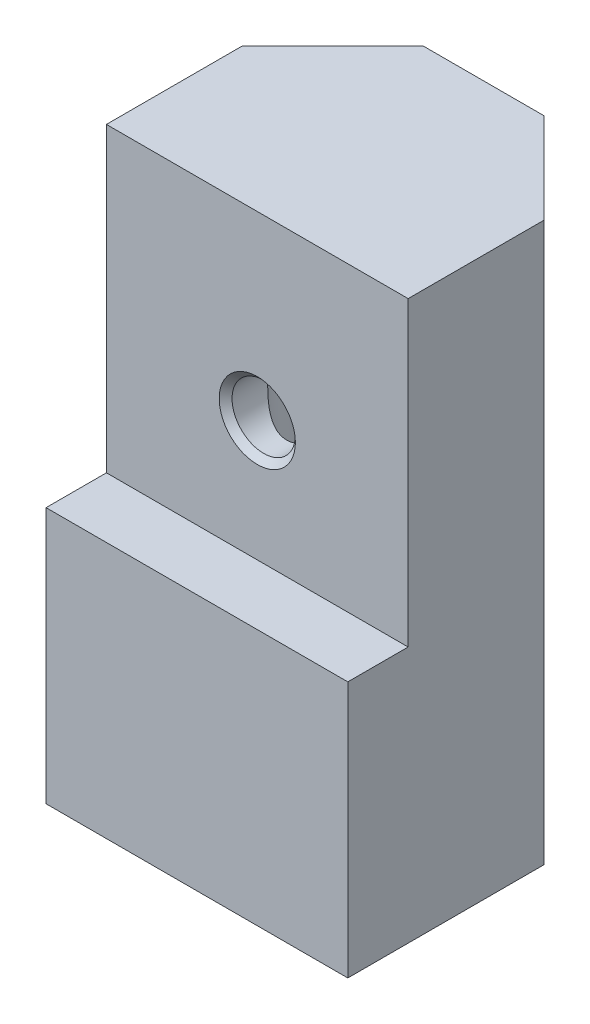
ISO-10303-21;
HEADER;
FILE_DESCRIPTION(('STEP AP214'),'2;1');
FILE_NAME('part.step','',(''),(''),'','','');
FILE_SCHEMA(('AUTOMOTIVE_DESIGN { 1 0 10303 214 1 1 1 1 }'));
ENDSEC;
DATA;
#1=APPLICATION_CONTEXT('core data for automotive mechanical design processes');
#2=APPLICATION_PROTOCOL_DEFINITION('international standard','automotive_design',2000,#1);
#3=PRODUCT_CONTEXT('',#1,'mechanical');
#4=PRODUCT('Part','Part','',(#3));
#5=PRODUCT_RELATED_PRODUCT_CATEGORY('part','',(#4));
#6=PRODUCT_DEFINITION_FORMATION('','',#4);
#7=PRODUCT_DEFINITION_CONTEXT('part definition',#1,'design');
#8=PRODUCT_DEFINITION('design','',#6,#7);
#9=PRODUCT_DEFINITION_SHAPE('','',#8);
#10=(LENGTH_UNIT() NAMED_UNIT(*) SI_UNIT(.MILLI.,.METRE.));
#11=(NAMED_UNIT(*) PLANE_ANGLE_UNIT() SI_UNIT($,.RADIAN.));
#12=(NAMED_UNIT(*) SI_UNIT($,.STERADIAN.) SOLID_ANGLE_UNIT());
#13=UNCERTAINTY_MEASURE_WITH_UNIT(LENGTH_MEASURE(1.E-05),#10,'distance_accuracy_value','');
#14=(GEOMETRIC_REPRESENTATION_CONTEXT(3) GLOBAL_UNCERTAINTY_ASSIGNED_CONTEXT((#13)) GLOBAL_UNIT_ASSIGNED_CONTEXT((#10,
#11,#12)) REPRESENTATION_CONTEXT('',''));
#15=CARTESIAN_POINT('',(0.,0.,0.));
#16=DIRECTION('',(0.,0.,1.));
#17=DIRECTION('',(1.,0.,0.));
#18=AXIS2_PLACEMENT_3D('',#15,#16,#17);
#19=CARTESIAN_POINT('',(0.,16.5,0.));
#20=DIRECTION('',(0.,0.,1.));
#21=DIRECTION('',(1.,0.,0.));
#22=AXIS2_PLACEMENT_3D('',#19,#20,#21);
#23=CYLINDRICAL_SURFACE('',#22,2.09999999999999);
#24=CARTESIAN_POINT('',(0.,16.5,-0.425000000000001));
#25=DIRECTION('',(0.,0.,1.));
#26=DIRECTION('',(1.,0.,0.));
#27=AXIS2_PLACEMENT_3D('',#24,#25,#26);
#28=CIRCLE('',#27,2.1);
#29=CARTESIAN_POINT('',(2.1,16.5,-0.425000000000001));
#30=VERTEX_POINT('',#29);
#31=EDGE_CURVE('E186',#30,#30,#28,.T.);
#32=ORIENTED_EDGE('',*,*,#31,.T.);
#33=EDGE_LOOP('',(#32));
#34=FACE_BOUND('',#33,.T.);
#35=CARTESIAN_POINT('',(0.,16.5,-9.8));
#36=DIRECTION('',(0.,0.,1.));
#37=DIRECTION('',(1.,0.,0.));
#38=AXIS2_PLACEMENT_3D('',#35,#36,#37);
#39=CIRCLE('',#38,2.09999999999999);
#40=CARTESIAN_POINT('',(2.09999999999999,16.5,-9.8));
#41=VERTEX_POINT('',#40);
#42=EDGE_CURVE('E189',#41,#41,#39,.T.);
#43=ORIENTED_EDGE('',*,*,#42,.F.);
#44=EDGE_LOOP('',(#43));
#45=FACE_BOUND('',#44,.T.);
#46=DIRECTION('',(0.,0.,1.));
#47=VECTOR('',#46,1.);
#48=CARTESIAN_POINT('',(2.1,16.5,0.));
#49=LINE('',#48,#47);
#50=CARTESIAN_POINT('',(2.1,16.5,-2.78810036394053));
#51=VERTEX_POINT('',#50);
#52=CARTESIAN_POINT('',(2.1,16.5,-7.21189963605947));
#53=VERTEX_POINT('',#52);
#54=EDGE_CURVE('E125',#51,#53,#49,.F.);
#55=ORIENTED_EDGE('',*,*,#54,.F.);
#56=CARTESIAN_POINT('',(2.1,16.5,-2.78810036394053));
#57=CARTESIAN_POINT('',(2.10001406550202,16.44890564578,-2.78813122960637));
#58=CARTESIAN_POINT('',(2.09813591396976,16.3978309349453,-2.78633076818849));
#59=CARTESIAN_POINT('',(2.09070878581308,16.2962603617513,-2.7793056900791));
#60=CARTESIAN_POINT('',(2.08516529758865,16.2457637485934,-2.77408619308978));
#61=CARTESIAN_POINT('',(2.07059789933959,16.1462622089026,-2.76053225536017));
#62=CARTESIAN_POINT('',(2.06161140051655,16.0972471565233,-2.75223132612759));
#63=CARTESIAN_POINT('',(2.04033021335461,16.0004917958691,-2.73289602787303));
#64=CARTESIAN_POINT('',(2.02803443434097,15.9527519135781,-2.7218607577605));
#65=CARTESIAN_POINT('',(1.98662417018042,15.8124015041972,-2.68544440520967));
#66=CARTESIAN_POINT('',(1.95288630713199,15.7220005483784,-2.65665274536502));
#67=CARTESIAN_POINT('',(1.87432121286916,15.5481200215617,-2.5933490864818));
#68=CARTESIAN_POINT('',(1.82946027170129,15.4646625399468,-2.55881980573055));
#69=CARTESIAN_POINT('',(1.72126821431826,15.2919981107851,-2.48109648006271));
#70=CARTESIAN_POINT('',(1.65610436927869,15.2041543502147,-2.43741786333745));
#71=CARTESIAN_POINT('',(1.51288716119124,15.0394906861281,-2.35033763996556));
#72=CARTESIAN_POINT('',(1.43482699231496,14.9626766435914,-2.30693619221924));
#73=CARTESIAN_POINT('',(1.25307146604847,14.8100170616356,-2.21716908070368));
#74=CARTESIAN_POINT('',(1.14727349331478,14.7362693244472,-2.17143013855408));
#75=CARTESIAN_POINT('',(0.921039956696543,14.6083128106554,-2.08992195742543));
#76=CARTESIAN_POINT('',(0.800631462785345,14.5540686159494,-2.05413467346997));
#77=CARTESIAN_POINT('',(0.581766959089313,14.4798028224355,-2.0044767996672));
#78=CARTESIAN_POINT('',(0.48582187503762,14.4545388431992,-1.98732083723429));
#79=CARTESIAN_POINT('',(0.290171999516886,14.4177700899993,-1.9622383894417));
#80=CARTESIAN_POINT('',(0.190470256332846,14.4062543980712,-1.9543045806005));
#81=CARTESIAN_POINT('',(-0.0100357823659216,14.3976231729419,-1.94836457385758));
#82=CARTESIAN_POINT('',(-0.110841743212122,14.4005336706207,-1.95037632188338));
#83=CARTESIAN_POINT('',(-0.310340753496205,14.4206381075267,-1.96418159812264));
#84=CARTESIAN_POINT('',(-0.409033179059682,14.4378362061511,-1.97597797482941));
#85=CARTESIAN_POINT('',(-0.59961992575892,14.4850787360832,-2.00799157758927));
#86=CARTESIAN_POINT('',(-0.691611709166461,14.514854663305,-2.02803258109019));
#87=CARTESIAN_POINT('',(-0.869119023411998,14.5858993090503,-2.07500891605762));
#88=CARTESIAN_POINT('',(-0.954633392230693,14.6271700835164,-2.10194548077899));
#89=CARTESIAN_POINT('',(-1.12720624367349,14.7250831477644,-2.16429143398575));
#90=CARTESIAN_POINT('',(-1.21335468088979,14.7829329037665,-2.20031329893575));
#91=CARTESIAN_POINT('',(-1.37528820402201,14.9096620634372,-2.27619794390948));
#92=CARTESIAN_POINT('',(-1.4510612472954,14.978554085896,-2.31606509720986));
#93=CARTESIAN_POINT('',(-1.60377665051855,15.1390367903445,-2.40395775706974));
#94=CARTESIAN_POINT('',(-1.67864220745733,15.2324919452245,-2.45219893140183));
#95=CARTESIAN_POINT('',(-1.81209350603637,15.4319643949111,-2.54532526320275));
#96=CARTESIAN_POINT('',(-1.87068403840911,15.5379779798706,-2.59021140541254));
#97=CARTESIAN_POINT('',(-1.95753033435109,15.7341115195755,-2.66057706952803));
#98=CARTESIAN_POINT('',(-1.98970157463716,15.8217540044552,-2.68811635077189));
#99=CARTESIAN_POINT('',(-2.04237434747996,16.0025061717334,-2.734508457242));
#100=CARTESIAN_POINT('',(-2.06291693598073,16.0955953230122,-2.75339179749609));
#101=CARTESIAN_POINT('',(-2.08463272386927,16.241237318493,-2.77358753707706));
#102=CARTESIAN_POINT('',(-2.09037039538955,16.2925842608368,-2.77898731101835));
#103=CARTESIAN_POINT('',(-2.09806402040135,16.395939884468,-2.78626161901712));
#104=CARTESIAN_POINT('',(-2.10001013542928,16.4479499357716,-2.78812698151683));
#105=CARTESIAN_POINT('',(-2.09999999999999,16.5,-2.78810036394053));
#106=B_SPLINE_CURVE_WITH_KNOTS('',3,(#56,#57,#58,#59,#60,#61,#62,#63,#64,#65,#66,#67,#68,#69,
#70,#71,#72,#73,#74,#75,#76,#77,#78,#79,#80,#81,#82,#83,#84,#85,#86,#87,#88,#89,#90,#91,#92,#93,
#94,#95,#96,#97,#98,#99,#100,#101,#102,#103,#104,#105),.UNSPECIFIED.,.F.,.F.,(4,2,2,2,2,2,2,2,2,
2,2,2,2,2,2,2,2,2,2,2,2,2,2,2,4),(0.,0.153185243370379,0.306141628187108,0.45748110256166,
0.608870516710041,0.909651176419752,1.21135477861481,1.56338559805909,1.91560279307157,
2.32384851334951,2.73134907659973,3.03211266815019,3.33263725428451,3.63370430967053,
3.93485904223187,4.22988618534556,4.52496613027641,4.85326702019536,5.18194579362882,
5.56763385280446,5.95320825985618,6.24423203568071,6.5342218143046,6.68982713941108,
6.84583569970781),.UNSPECIFIED.);
#107=CARTESIAN_POINT('',(-2.09999999999999,16.5,-2.78810036394053));
#108=VERTEX_POINT('',#107);
#109=EDGE_CURVE('E140',#51,#108,#106,.T.);
#110=ORIENTED_EDGE('',*,*,#109,.T.);
#111=DIRECTION('',(0.,0.,1.));
#112=VECTOR('',#111,1.);
#113=CARTESIAN_POINT('',(-2.09999999999999,16.5,0.));
#114=LINE('',#113,#112);
#115=CARTESIAN_POINT('',(-2.09999999999999,16.5,-7.21189963605947));
#116=VERTEX_POINT('',#115);
#117=EDGE_CURVE('E144',#116,#108,#114,.T.);
#118=ORIENTED_EDGE('',*,*,#117,.F.);
#119=CARTESIAN_POINT('',(-2.09999999999999,16.5,-7.21189963605947));
#120=CARTESIAN_POINT('',(-2.10001406550202,16.44890564578,-7.21186877039364));
#121=CARTESIAN_POINT('',(-2.09813591396976,16.3978309349453,-7.21366923181151));
#122=CARTESIAN_POINT('',(-2.09070878581308,16.2962603617513,-7.2206943099209));
#123=CARTESIAN_POINT('',(-2.08516529758865,16.2457637485934,-7.22591380691022));
#124=CARTESIAN_POINT('',(-2.07059789933958,16.1462622089026,-7.23946774463983));
#125=CARTESIAN_POINT('',(-2.06161140051654,16.0972471565233,-7.24776867387241));
#126=CARTESIAN_POINT('',(-2.04033021335461,16.0004917958691,-7.26710397212697));
#127=CARTESIAN_POINT('',(-2.02803443434096,15.9527519135781,-7.2781392422395));
#128=CARTESIAN_POINT('',(-1.98662417018042,15.8124015041972,-7.31455559479033));
#129=CARTESIAN_POINT('',(-1.95288630713199,15.7220005483784,-7.34334725463498));
#130=CARTESIAN_POINT('',(-1.87432121286915,15.5481200215617,-7.4066509135182));
#131=CARTESIAN_POINT('',(-1.82946027170128,15.4646625399468,-7.44118019426945));
#132=CARTESIAN_POINT('',(-1.72126821431826,15.2919981107851,-7.51890351993729));
#133=CARTESIAN_POINT('',(-1.65610436927869,15.2041543502147,-7.56258213666256));
#134=CARTESIAN_POINT('',(-1.51288716119123,15.0394906861281,-7.64966236003444));
#135=CARTESIAN_POINT('',(-1.43482699231496,14.9626766435914,-7.69306380778076));
#136=CARTESIAN_POINT('',(-1.25307146604846,14.8100170616356,-7.78283091929632));
#137=CARTESIAN_POINT('',(-1.14727349331478,14.7362693244472,-7.82856986144592));
#138=CARTESIAN_POINT('',(-0.921039956696539,14.6083128106554,-7.91007804257457));
#139=CARTESIAN_POINT('',(-0.800631462785341,14.5540686159494,-7.94586532653003));
#140=CARTESIAN_POINT('',(-0.581766959089311,14.4798028224355,-7.99552320033279));
#141=CARTESIAN_POINT('',(-0.485821875037618,14.4545388431992,-8.0126791627657));
#142=CARTESIAN_POINT('',(-0.290171999516883,14.4177700899993,-8.0377616105583));
#143=CARTESIAN_POINT('',(-0.190470256332844,14.4062543980712,-8.04569541939949));
#144=CARTESIAN_POINT('',(0.0100357823659245,14.3976231729419,-8.05163542614242));
#145=CARTESIAN_POINT('',(0.110841743212125,14.4005336706207,-8.04962367811662));
#146=CARTESIAN_POINT('',(0.310340753496208,14.4206381075267,-8.03581840187736));
#147=CARTESIAN_POINT('',(0.409033179059685,14.4378362061511,-8.02402202517059));
#148=CARTESIAN_POINT('',(0.599619925758922,14.4850787360832,-7.99200842241073));
#149=CARTESIAN_POINT('',(0.691611709166463,14.514854663305,-7.97196741890981));
#150=CARTESIAN_POINT('',(0.869119023412,14.5858993090503,-7.92499108394238));
#151=CARTESIAN_POINT('',(0.954633392230695,14.6271700835164,-7.89805451922101));
#152=CARTESIAN_POINT('',(1.12720624367349,14.7250831477644,-7.83570856601425));
#153=CARTESIAN_POINT('',(1.21335468088979,14.7829329037665,-7.79968670106425));
#154=CARTESIAN_POINT('',(1.37528820402201,14.9096620634372,-7.72380205609051));
#155=CARTESIAN_POINT('',(1.4510612472954,14.978554085896,-7.68393490279013));
#156=CARTESIAN_POINT('',(1.60377665051855,15.1390367903445,-7.59604224293026));
#157=CARTESIAN_POINT('',(1.67864220745734,15.2324919452245,-7.54780106859816));
#158=CARTESIAN_POINT('',(1.81209350603637,15.4319643949111,-7.45467473679724));
#159=CARTESIAN_POINT('',(1.87068403840912,15.5379779798706,-7.40978859458746));
#160=CARTESIAN_POINT('',(1.95753033435109,15.7341115195755,-7.33942293047197));
#161=CARTESIAN_POINT('',(1.98970157463716,15.8217540044552,-7.31188364922811));
#162=CARTESIAN_POINT('',(2.04237434747997,16.0025061717334,-7.26549154275799));
#163=CARTESIAN_POINT('',(2.06291693598074,16.0955953230122,-7.24660820250391));
#164=CARTESIAN_POINT('',(2.08463272386927,16.241237318493,-7.22641246292294));
#165=CARTESIAN_POINT('',(2.09037039538955,16.2925842608368,-7.22101268898165));
#166=CARTESIAN_POINT('',(2.09806402040135,16.395939884468,-7.21373838098287));
#167=CARTESIAN_POINT('',(2.10001013542928,16.4479499357716,-7.21187301848316));
#168=CARTESIAN_POINT('',(2.1,16.5,-7.21189963605947));
#169=B_SPLINE_CURVE_WITH_KNOTS('',3,(#119,#120,#121,#122,#123,#124,#125,#126,#127,#128,#129,
#130,#131,#132,#133,#134,#135,#136,#137,#138,#139,#140,#141,#142,#143,#144,#145,#146,#147,#148,
#149,#150,#151,#152,#153,#154,#155,#156,#157,#158,#159,#160,#161,#162,#163,#164,#165,#166,#167,
#168),.UNSPECIFIED.,.F.,.F.,(4,2,2,2,2,2,2,2,2,2,2,2,2,2,2,2,2,2,2,2,2,2,2,2,4),(0.,
0.153185243370379,0.306141628187108,0.45748110256166,0.608870516710041,0.909651176419752,
1.21135477861481,1.56338559805909,1.91560279307157,2.32384851334951,2.73134907659973,
3.03211266815019,3.33263725428451,3.63370430967053,3.93485904223187,4.22988618534556,
4.52496613027641,4.85326702019536,5.18194579362881,5.56763385280446,5.95320825985617,
6.24423203568071,6.53422181430459,6.68982713941108,6.84583569970781),.UNSPECIFIED.);
#170=EDGE_CURVE('E133',#116,#53,#169,.T.);
#171=ORIENTED_EDGE('',*,*,#170,.T.);
#172=EDGE_LOOP('',(#55,#110,#118,#171));
#173=FACE_BOUND('',#172,.T.);
#174=ADVANCED_FACE('F43',(#34,#45,#173),#23,.F.);
#175=CARTESIAN_POINT('',(-10.,8.5,4.));
#176=DIRECTION('',(1.,0.,0.));
#177=DIRECTION('',(0.,1.,0.));
#178=AXIS2_PLACEMENT_3D('',#175,#176,#177);
#179=PLANE('',#178);
#180=DIRECTION('',(0.,0.,1.));
#181=VECTOR('',#180,1.);
#182=CARTESIAN_POINT('',(-10.,28.5,-15.));
#183=LINE('',#182,#181);
#184=CARTESIAN_POINT('',(-10.,28.5,-8.99999999999997));
#185=VERTEX_POINT('',#184);
#186=CARTESIAN_POINT('',(-10.,28.5,0.));
#187=VERTEX_POINT('',#186);
#188=EDGE_CURVE('E212',#185,#187,#183,.T.);
#189=ORIENTED_EDGE('',*,*,#188,.F.);
#190=DIRECTION('',(0.,-1.,0.));
#191=VECTOR('',#190,1.);
#192=CARTESIAN_POINT('',(-10.,8.5,-8.99999999999997));
#193=LINE('',#192,#191);
#194=CARTESIAN_POINT('',(-10.,-8.5,-8.99999999999997));
#195=VERTEX_POINT('',#194);
#196=EDGE_CURVE('E66',#185,#195,#193,.T.);
#197=ORIENTED_EDGE('',*,*,#196,.T.);
#198=DIRECTION('',(0.,0.,-1.));
#199=VECTOR('',#198,1.);
#200=CARTESIAN_POINT('',(-10.,-8.5,4.));
#201=LINE('',#200,#199);
#202=CARTESIAN_POINT('',(-10.,-8.5,4.));
#203=VERTEX_POINT('',#202);
#204=EDGE_CURVE('E234',#203,#195,#201,.T.);
#205=ORIENTED_EDGE('',*,*,#204,.F.);
#206=DIRECTION('',(0.,-1.,0.));
#207=VECTOR('',#206,1.);
#208=CARTESIAN_POINT('',(-10.,8.5,4.));
#209=LINE('',#208,#207);
#210=CARTESIAN_POINT('',(-10.,8.5,4.));
#211=VERTEX_POINT('',#210);
#212=EDGE_CURVE('E215',#211,#203,#209,.T.);
#213=ORIENTED_EDGE('',*,*,#212,.F.);
#214=DIRECTION('',(0.,0.,-1.));
#215=VECTOR('',#214,1.);
#216=CARTESIAN_POINT('',(-10.,8.5,4.));
#217=LINE('',#216,#215);
#218=CARTESIAN_POINT('',(-10.,8.5,0.));
#219=VERTEX_POINT('',#218);
#220=EDGE_CURVE('E224',#211,#219,#217,.T.);
#221=ORIENTED_EDGE('',*,*,#220,.T.);
#222=DIRECTION('',(0.,1.,0.));
#223=VECTOR('',#222,1.);
#224=CARTESIAN_POINT('',(-10.,-8.5,0.));
#225=LINE('',#224,#223);
#226=EDGE_CURVE('E194',#219,#187,#225,.T.);
#227=ORIENTED_EDGE('',*,*,#226,.T.);
#228=EDGE_LOOP('',(#189,#197,#205,#213,#221,#227));
#229=FACE_BOUND('',#228,.T.);
#230=ADVANCED_FACE('F177',(#229),#179,.F.);
#231=CARTESIAN_POINT('',(-10.,-8.5,4.));
#232=DIRECTION('',(0.,1.,0.));
#233=DIRECTION('',(0.,0.,1.));
#234=AXIS2_PLACEMENT_3D('',#231,#232,#233);
#235=PLANE('',#234);
#236=CARTESIAN_POINT('',(0.,-8.5,-5.));
#237=DIRECTION('',(0.,-1.,0.));
#238=DIRECTION('',(0.,0.,-1.));
#239=AXIS2_PLACEMENT_3D('',#236,#237,#238);
#240=CIRCLE('',#239,3.05);
#241=CARTESIAN_POINT('',(0.,-8.5,-8.05));
#242=VERTEX_POINT('',#241);
#243=EDGE_CURVE('E237',#242,#242,#240,.T.);
#244=ORIENTED_EDGE('',*,*,#243,.F.);
#245=EDGE_LOOP('',(#244));
#246=FACE_BOUND('',#245,.T.);
#247=ORIENTED_EDGE('',*,*,#204,.T.);
#248=DIRECTION('',(-0.707106781186546,0.,0.707106781186549));
#249=VECTOR('',#248,1.);
#250=CARTESIAN_POINT('',(-3.99999999999999,-8.5,-15.));
#251=LINE('',#250,#249);
#252=CARTESIAN_POINT('',(-3.99999999999999,-8.5,-15.));
#253=VERTEX_POINT('',#252);
#254=EDGE_CURVE('E51',#195,#253,#251,.F.);
#255=ORIENTED_EDGE('',*,*,#254,.T.);
#256=DIRECTION('',(-1.,0.,0.));
#257=VECTOR('',#256,1.);
#258=CARTESIAN_POINT('',(10.,-8.5,-15.));
#259=LINE('',#258,#257);
#260=CARTESIAN_POINT('',(4.,-8.5,-15.));
#261=VERTEX_POINT('',#260);
#262=EDGE_CURVE('E199',#261,#253,#259,.T.);
#263=ORIENTED_EDGE('',*,*,#262,.F.);
#264=DIRECTION('',(-0.707106781186546,0.,-0.707106781186549));
#265=VECTOR('',#264,1.);
#266=CARTESIAN_POINT('',(4.,-8.5,-15.));
#267=LINE('',#266,#265);
#268=CARTESIAN_POINT('',(10.,-8.5,-8.99999999999997));
#269=VERTEX_POINT('',#268);
#270=EDGE_CURVE('E58',#261,#269,#267,.F.);
#271=ORIENTED_EDGE('',*,*,#270,.T.);
#272=DIRECTION('',(0.,0.,-1.));
#273=VECTOR('',#272,1.);
#274=CARTESIAN_POINT('',(10.,-8.5,4.));
#275=LINE('',#274,#273);
#276=CARTESIAN_POINT('',(10.,-8.5,4.));
#277=VERTEX_POINT('',#276);
#278=EDGE_CURVE('E232',#277,#269,#275,.T.);
#279=ORIENTED_EDGE('',*,*,#278,.F.);
#280=DIRECTION('',(1.,0.,0.));
#281=VECTOR('',#280,1.);
#282=CARTESIAN_POINT('',(-10.,-8.5,4.));
#283=LINE('',#282,#281);
#284=EDGE_CURVE('E218',#203,#277,#283,.T.);
#285=ORIENTED_EDGE('',*,*,#284,.F.);
#286=EDGE_LOOP('',(#247,#255,#263,#271,#279,#285));
#287=FACE_BOUND('',#286,.T.);
#288=ADVANCED_FACE('F182',(#246,#287),#235,.F.);
#289=CARTESIAN_POINT('',(10.,8.5,4.));
#290=DIRECTION('',(-1.,0.,0.));
#291=DIRECTION('',(0.,-1.,0.));
#292=AXIS2_PLACEMENT_3D('',#289,#290,#291);
#293=PLANE('',#292);
#294=ORIENTED_EDGE('',*,*,#278,.T.);
#295=DIRECTION('',(0.,1.,0.));
#296=VECTOR('',#295,1.);
#297=CARTESIAN_POINT('',(10.,8.5,-8.99999999999997));
#298=LINE('',#297,#296);
#299=CARTESIAN_POINT('',(10.,28.5,-8.99999999999997));
#300=VERTEX_POINT('',#299);
#301=EDGE_CURVE('E11',#269,#300,#298,.T.);
#302=ORIENTED_EDGE('',*,*,#301,.T.);
#303=DIRECTION('',(0.,0.,1.));
#304=VECTOR('',#303,1.);
#305=CARTESIAN_POINT('',(10.,28.5,-15.));
#306=LINE('',#305,#304);
#307=CARTESIAN_POINT('',(10.,28.5,0.));
#308=VERTEX_POINT('',#307);
#309=EDGE_CURVE('E205',#300,#308,#306,.T.);
#310=ORIENTED_EDGE('',*,*,#309,.T.);
#311=DIRECTION('',(0.,-1.,0.));
#312=VECTOR('',#311,1.);
#313=CARTESIAN_POINT('',(10.,-8.5,0.));
#314=LINE('',#313,#312);
#315=CARTESIAN_POINT('',(10.,8.5,0.));
#316=VERTEX_POINT('',#315);
#317=EDGE_CURVE('E191',#308,#316,#314,.T.);
#318=ORIENTED_EDGE('',*,*,#317,.T.);
#319=DIRECTION('',(0.,0.,-1.));
#320=VECTOR('',#319,1.);
#321=CARTESIAN_POINT('',(10.,8.5,4.));
#322=LINE('',#321,#320);
#323=CARTESIAN_POINT('',(10.,8.5,4.));
#324=VERTEX_POINT('',#323);
#325=EDGE_CURVE('E229',#324,#316,#322,.T.);
#326=ORIENTED_EDGE('',*,*,#325,.F.);
#327=DIRECTION('',(0.,1.,0.));
#328=VECTOR('',#327,1.);
#329=CARTESIAN_POINT('',(10.,8.5,4.));
#330=LINE('',#329,#328);
#331=EDGE_CURVE('E220',#277,#324,#330,.T.);
#332=ORIENTED_EDGE('',*,*,#331,.F.);
#333=EDGE_LOOP('',(#294,#302,#310,#318,#326,#332));
#334=FACE_BOUND('',#333,.T.);
#335=ADVANCED_FACE('F255',(#334),#293,.F.);
#336=CARTESIAN_POINT('',(-10.,8.5,4.));
#337=DIRECTION('',(0.,-1.,0.));
#338=DIRECTION('',(0.,0.,-1.));
#339=AXIS2_PLACEMENT_3D('',#336,#337,#338);
#340=PLANE('',#339);
#341=DIRECTION('',(-1.,0.,0.));
#342=VECTOR('',#341,1.);
#343=CARTESIAN_POINT('',(-10.,8.5,0.));
#344=LINE('',#343,#342);
#345=EDGE_CURVE('E214',#316,#219,#344,.T.);
#346=ORIENTED_EDGE('',*,*,#345,.T.);
#347=ORIENTED_EDGE('',*,*,#220,.F.);
#348=DIRECTION('',(-1.,0.,0.));
#349=VECTOR('',#348,1.);
#350=CARTESIAN_POINT('',(-10.,8.5,4.));
#351=LINE('',#350,#349);
#352=EDGE_CURVE('E222',#324,#211,#351,.T.);
#353=ORIENTED_EDGE('',*,*,#352,.F.);
#354=ORIENTED_EDGE('',*,*,#325,.T.);
#355=EDGE_LOOP('',(#346,#347,#353,#354));
#356=FACE_BOUND('',#355,.T.);
#357=ADVANCED_FACE('F259',(#356),#340,.F.);
#358=CARTESIAN_POINT('',(0.,0.,4.));
#359=DIRECTION('',(0.,0.,1.));
#360=DIRECTION('',(1.,0.,0.));
#361=AXIS2_PLACEMENT_3D('',#358,#359,#360);
#362=PLANE('',#361);
#363=ORIENTED_EDGE('',*,*,#212,.T.);
#364=ORIENTED_EDGE('',*,*,#284,.T.);
#365=ORIENTED_EDGE('',*,*,#331,.T.);
#366=ORIENTED_EDGE('',*,*,#352,.T.);
#367=EDGE_LOOP('',(#363,#364,#365,#366));
#368=FACE_BOUND('',#367,.T.);
#369=ADVANCED_FACE('F247',(#368),#362,.T.);
#370=CARTESIAN_POINT('',(0.,0.,0.));
#371=DIRECTION('',(0.,0.,1.));
#372=DIRECTION('',(1.,0.,0.));
#373=AXIS2_PLACEMENT_3D('',#370,#371,#372);
#374=PLANE('',#373);
#375=CARTESIAN_POINT('',(0.,16.5,0.));
#376=DIRECTION('',(0.,0.,1.));
#377=DIRECTION('',(1.,0.,0.));
#378=AXIS2_PLACEMENT_3D('',#375,#376,#377);
#379=CIRCLE('',#378,2.525);
#380=CARTESIAN_POINT('',(2.525,16.5,0.));
#381=VERTEX_POINT('',#380);
#382=EDGE_CURVE('E141',#381,#381,#379,.T.);
#383=ORIENTED_EDGE('',*,*,#382,.F.);
#384=EDGE_LOOP('',(#383));
#385=FACE_BOUND('',#384,.T.);
#386=ORIENTED_EDGE('',*,*,#345,.F.);
#387=ORIENTED_EDGE('',*,*,#317,.F.);
#388=DIRECTION('',(1.,0.,0.));
#389=VECTOR('',#388,1.);
#390=CARTESIAN_POINT('',(10.,28.5,0.));
#391=LINE('',#390,#389);
#392=EDGE_CURVE('E203',#187,#308,#391,.T.);
#393=ORIENTED_EDGE('',*,*,#392,.F.);
#394=ORIENTED_EDGE('',*,*,#226,.F.);
#395=EDGE_LOOP('',(#386,#387,#393,#394));
#396=FACE_BOUND('',#395,.T.);
#397=ADVANCED_FACE('F243',(#385,#396),#374,.T.);
#398=CARTESIAN_POINT('',(10.,28.5,-15.));
#399=DIRECTION('',(0.,-1.,0.));
#400=DIRECTION('',(0.,0.,-1.));
#401=AXIS2_PLACEMENT_3D('',#398,#399,#400);
#402=PLANE('',#401);
#403=DIRECTION('',(1.,0.,0.));
#404=VECTOR('',#403,1.);
#405=CARTESIAN_POINT('',(10.,28.5,-15.));
#406=LINE('',#405,#404);
#407=CARTESIAN_POINT('',(-4.,28.5,-15.));
#408=VERTEX_POINT('',#407);
#409=CARTESIAN_POINT('',(3.99999999999999,28.5,-15.));
#410=VERTEX_POINT('',#409);
#411=EDGE_CURVE('E202',#408,#410,#406,.T.);
#412=ORIENTED_EDGE('',*,*,#411,.F.);
#413=DIRECTION('',(0.707106781186546,0.,-0.707106781186549));
#414=VECTOR('',#413,1.);
#415=CARTESIAN_POINT('',(-4.,28.5,-15.));
#416=LINE('',#415,#414);
#417=EDGE_CURVE('E270',#408,#185,#416,.F.);
#418=ORIENTED_EDGE('',*,*,#417,.T.);
#419=ORIENTED_EDGE('',*,*,#188,.T.);
#420=ORIENTED_EDGE('',*,*,#392,.T.);
#421=ORIENTED_EDGE('',*,*,#309,.F.);
#422=DIRECTION('',(0.707106781186546,0.,0.707106781186549));
#423=VECTOR('',#422,1.);
#424=CARTESIAN_POINT('',(3.99999999999999,28.5,-15.));
#425=LINE('',#424,#423);
#426=EDGE_CURVE('E267',#300,#410,#425,.F.);
#427=ORIENTED_EDGE('',*,*,#426,.T.);
#428=EDGE_LOOP('',(#412,#418,#419,#420,#421,#427));
#429=FACE_BOUND('',#428,.T.);
#430=ADVANCED_FACE('F246',(#429),#402,.F.);
#431=CARTESIAN_POINT('',(0.,0.,-15.));
#432=DIRECTION('',(0.,0.,1.));
#433=DIRECTION('',(1.,0.,0.));
#434=AXIS2_PLACEMENT_3D('',#431,#432,#433);
#435=PLANE('',#434);
#436=ORIENTED_EDGE('',*,*,#262,.T.);
#437=DIRECTION('',(0.,1.,0.));
#438=VECTOR('',#437,1.);
#439=CARTESIAN_POINT('',(-3.99999999999999,0.,-15.));
#440=LINE('',#439,#438);
#441=EDGE_CURVE('E271',#253,#408,#440,.T.);
#442=ORIENTED_EDGE('',*,*,#441,.T.);
#443=ORIENTED_EDGE('',*,*,#411,.T.);
#444=DIRECTION('',(0.,-1.,0.));
#445=VECTOR('',#444,1.);
#446=CARTESIAN_POINT('',(4.,0.,-15.));
#447=LINE('',#446,#445);
#448=EDGE_CURVE('E132',#410,#261,#447,.T.);
#449=ORIENTED_EDGE('',*,*,#448,.T.);
#450=EDGE_LOOP('',(#436,#442,#443,#449));
#451=FACE_BOUND('',#450,.T.);
#452=ADVANCED_FACE('F172',(#451),#435,.F.);
#453=CARTESIAN_POINT('',(0.,16.5,-9.8));
#454=DIRECTION('',(0.,0.,1.));
#455=DIRECTION('',(1.,0.,0.));
#456=AXIS2_PLACEMENT_3D('',#453,#454,#455);
#457=CONICAL_SURFACE('',#456,2.09999999999999,1.02974425867665);
#458=CARTESIAN_POINT('',(0.,16.5,-11.0618072999579));
#459=VERTEX_POINT('',#458);
#460=VERTEX_LOOP('',#459);
#461=FACE_BOUND('',#460,.T.);
#462=ORIENTED_EDGE('',*,*,#42,.T.);
#463=EDGE_LOOP('',(#462));
#464=FACE_BOUND('',#463,.T.);
#465=ADVANCED_FACE('F167',(#461,#464),#457,.F.);
#466=CARTESIAN_POINT('',(0.,16.5,0.));
#467=DIRECTION('',(0.,0.,1.));
#468=DIRECTION('',(1.,0.,0.));
#469=AXIS2_PLACEMENT_3D('',#466,#467,#468);
#470=CONICAL_SURFACE('',#469,2.525,0.785398163397446);
#471=ORIENTED_EDGE('',*,*,#31,.F.);
#472=EDGE_LOOP('',(#471));
#473=FACE_BOUND('',#472,.T.);
#474=ORIENTED_EDGE('',*,*,#382,.T.);
#475=EDGE_LOOP('',(#474));
#476=FACE_BOUND('',#475,.T.);
#477=ADVANCED_FACE('F163',(#473,#476),#470,.F.);
#478=CARTESIAN_POINT('',(0.,16.5,-5.));
#479=DIRECTION('',(0.,-1.,0.));
#480=DIRECTION('',(0.,0.,-1.));
#481=AXIS2_PLACEMENT_3D('',#478,#479,#480);
#482=CYLINDRICAL_SURFACE('',#481,3.05);
#483=ORIENTED_EDGE('',*,*,#243,.T.);
#484=EDGE_LOOP('',(#483));
#485=FACE_BOUND('',#484,.T.);
#486=CARTESIAN_POINT('',(0.,16.5,-5.));
#487=DIRECTION('',(0.,-1.,0.));
#488=DIRECTION('',(0.,0.,-1.));
#489=AXIS2_PLACEMENT_3D('',#486,#487,#488);
#490=CIRCLE('',#489,3.05);
#491=EDGE_CURVE('E142',#108,#116,#490,.T.);
#492=ORIENTED_EDGE('',*,*,#491,.F.);
#493=ORIENTED_EDGE('',*,*,#109,.F.);
#494=EDGE_CURVE('E128',#53,#51,#490,.T.);
#495=ORIENTED_EDGE('',*,*,#494,.F.);
#496=ORIENTED_EDGE('',*,*,#170,.F.);
#497=EDGE_LOOP('',(#492,#493,#495,#496));
#498=FACE_BOUND('',#497,.T.);
#499=ADVANCED_FACE('F138',(#485,#498),#482,.F.);
#500=CARTESIAN_POINT('',(0.,16.5,-5.));
#501=DIRECTION('',(0.,-1.,0.));
#502=DIRECTION('',(0.,0.,-1.));
#503=AXIS2_PLACEMENT_3D('',#500,#501,#502);
#504=PLANE('',#503);
#505=ORIENTED_EDGE('',*,*,#54,.T.);
#506=ORIENTED_EDGE('',*,*,#494,.T.);
#507=EDGE_LOOP('',(#505,#506));
#508=FACE_BOUND('',#507,.T.);
#509=ADVANCED_FACE('F127',(#508),#504,.T.);
#510=ORIENTED_EDGE('',*,*,#117,.T.);
#511=ORIENTED_EDGE('',*,*,#491,.T.);
#512=EDGE_LOOP('',(#510,#511));
#513=FACE_BOUND('',#512,.T.);
#514=ADVANCED_FACE('F236',(#513),#504,.T.);
#515=CARTESIAN_POINT('',(-3.99999999999999,0.,-15.));
#516=DIRECTION('',(0.707106781186549,0.,0.707106781186546));
#517=DIRECTION('',(0.,1.,0.));
#518=AXIS2_PLACEMENT_3D('',#515,#516,#517);
#519=PLANE('',#518);
#520=ORIENTED_EDGE('',*,*,#254,.F.);
#521=ORIENTED_EDGE('',*,*,#196,.F.);
#522=ORIENTED_EDGE('',*,*,#417,.F.);
#523=ORIENTED_EDGE('',*,*,#441,.F.);
#524=EDGE_LOOP('',(#520,#521,#522,#523));
#525=FACE_BOUND('',#524,.T.);
#526=ADVANCED_FACE('F282',(#525),#519,.F.);
#527=CARTESIAN_POINT('',(4.,0.,-15.));
#528=DIRECTION('',(-0.707106781186549,0.,0.707106781186546));
#529=DIRECTION('',(0.,-1.,0.));
#530=AXIS2_PLACEMENT_3D('',#527,#528,#529);
#531=PLANE('',#530);
#532=ORIENTED_EDGE('',*,*,#426,.F.);
#533=ORIENTED_EDGE('',*,*,#301,.F.);
#534=ORIENTED_EDGE('',*,*,#270,.F.);
#535=ORIENTED_EDGE('',*,*,#448,.F.);
#536=EDGE_LOOP('',(#532,#533,#534,#535));
#537=FACE_BOUND('',#536,.T.);
#538=ADVANCED_FACE('F45',(#537),#531,.F.);
#539=CLOSED_SHELL('',(#174,#230,#288,#335,#357,#369,#397,#430,#452,#465,#477,#499,#509,#514,
#526,#538));
#540=MANIFOLD_SOLID_BREP('B2',#539);
#541=ADVANCED_BREP_SHAPE_REPRESENTATION('',(#18,#540),#14);
#542=SHAPE_DEFINITION_REPRESENTATION(#9,#541);
ENDSEC;
END-ISO-10303-21;
